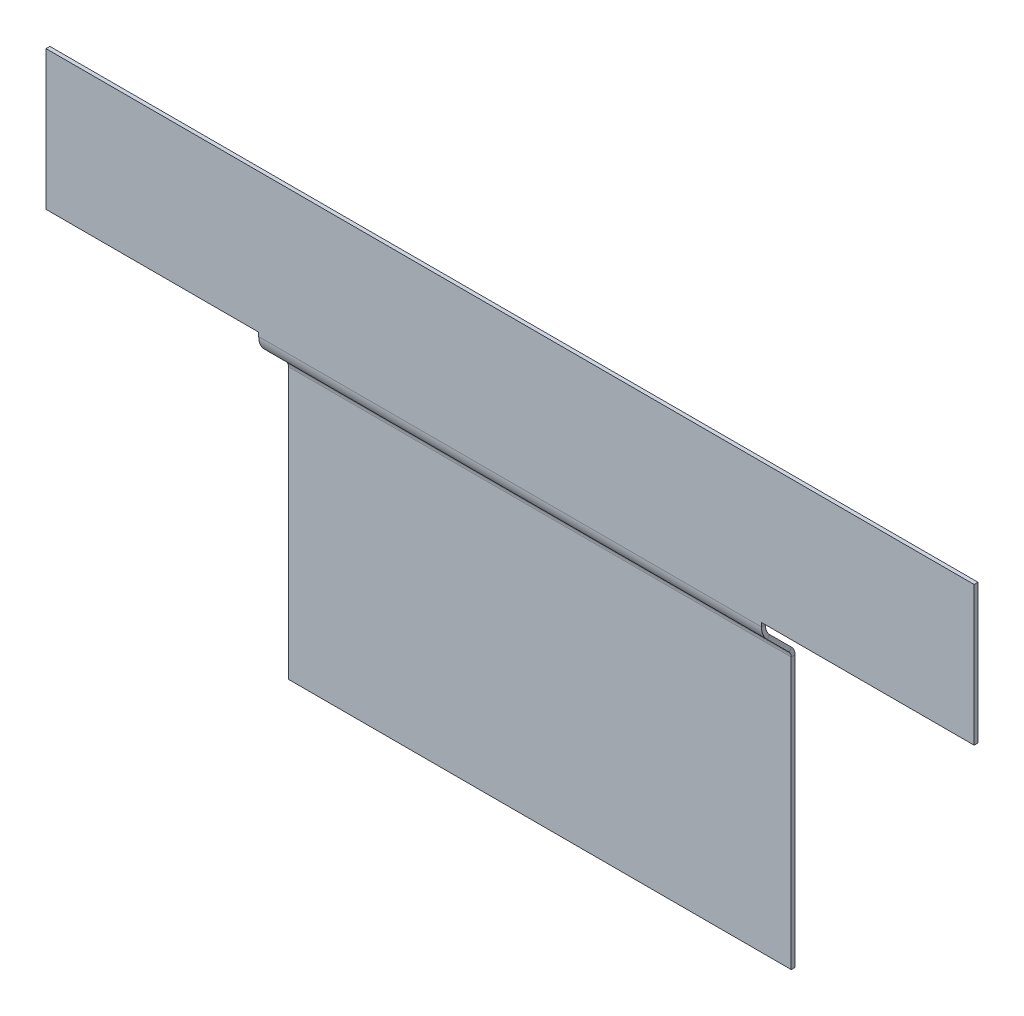
ISO-10303-21;
HEADER;
FILE_DESCRIPTION(('STEP AP214'),'2;1');
FILE_NAME('part.step','',(''),(''),'','','');
FILE_SCHEMA(('AUTOMOTIVE_DESIGN { 1 0 10303 214 1 1 1 1 }'));
ENDSEC;
DATA;
#1=APPLICATION_CONTEXT('core data for automotive mechanical design processes');
#2=APPLICATION_PROTOCOL_DEFINITION('international standard','automotive_design',2000,#1);
#3=PRODUCT_CONTEXT('',#1,'mechanical');
#4=PRODUCT('Part','Part','',(#3));
#5=PRODUCT_RELATED_PRODUCT_CATEGORY('part','',(#4));
#6=PRODUCT_DEFINITION_FORMATION('','',#4);
#7=PRODUCT_DEFINITION_CONTEXT('part definition',#1,'design');
#8=PRODUCT_DEFINITION('design','',#6,#7);
#9=PRODUCT_DEFINITION_SHAPE('','',#8);
#10=(LENGTH_UNIT() NAMED_UNIT(*) SI_UNIT(.MILLI.,.METRE.));
#11=(NAMED_UNIT(*) PLANE_ANGLE_UNIT() SI_UNIT($,.RADIAN.));
#12=(NAMED_UNIT(*) SI_UNIT($,.STERADIAN.) SOLID_ANGLE_UNIT());
#13=UNCERTAINTY_MEASURE_WITH_UNIT(LENGTH_MEASURE(1.E-05),#10,'distance_accuracy_value','');
#14=(GEOMETRIC_REPRESENTATION_CONTEXT(3) GLOBAL_UNCERTAINTY_ASSIGNED_CONTEXT((#13)) GLOBAL_UNIT_ASSIGNED_CONTEXT((#10,
#11,#12)) REPRESENTATION_CONTEXT('',''));
#15=CARTESIAN_POINT('',(0.,0.,0.));
#16=DIRECTION('',(0.,0.,1.));
#17=DIRECTION('',(1.,0.,0.));
#18=AXIS2_PLACEMENT_3D('',#15,#16,#17);
#19=CARTESIAN_POINT('',(-6.,-8.2,0.));
#20=DIRECTION('',(-1.,0.,0.));
#21=DIRECTION('',(0.,0.,1.));
#22=AXIS2_PLACEMENT_3D('',#19,#20,#21);
#23=PLANE('',#22);
#24=DIRECTION('',(0.,0.,1.));
#25=VECTOR('',#24,1.);
#26=CARTESIAN_POINT('',(-6.,-8.2,0.));
#27=LINE('',#26,#25);
#28=CARTESIAN_POINT('',(-6.,-8.2,0.));
#29=VERTEX_POINT('',#28);
#30=CARTESIAN_POINT('',(-6.,-8.2,0.05));
#31=VERTEX_POINT('',#30);
#32=EDGE_CURVE('E11',#29,#31,#27,.T.);
#33=ORIENTED_EDGE('',*,*,#32,.T.);
#34=DIRECTION('',(0.,1.,0.));
#35=VECTOR('',#34,1.);
#36=CARTESIAN_POINT('',(-6.,-8.2,0.05));
#37=LINE('',#36,#35);
#38=CARTESIAN_POINT('',(-6.,-6.4,0.05));
#39=VERTEX_POINT('',#38);
#40=EDGE_CURVE('E172',#31,#39,#37,.T.);
#41=ORIENTED_EDGE('',*,*,#40,.T.);
#42=DIRECTION('',(0.,0.,1.));
#43=VECTOR('',#42,1.);
#44=CARTESIAN_POINT('',(-6.,-6.4,0.));
#45=LINE('',#44,#43);
#46=CARTESIAN_POINT('',(-6.,-6.4,0.));
#47=VERTEX_POINT('',#46);
#48=EDGE_CURVE('E155',#47,#39,#45,.T.);
#49=ORIENTED_EDGE('',*,*,#48,.F.);
#50=DIRECTION('',(0.,1.,0.));
#51=VECTOR('',#50,1.);
#52=CARTESIAN_POINT('',(-6.,-8.2,0.));
#53=LINE('',#52,#51);
#54=EDGE_CURVE('E180',#29,#47,#53,.T.);
#55=ORIENTED_EDGE('',*,*,#54,.F.);
#56=EDGE_LOOP('',(#33,#41,#49,#55));
#57=FACE_BOUND('',#56,.T.);
#58=ADVANCED_FACE('F17',(#57),#23,.T.);
#59=CARTESIAN_POINT('',(-3.25,-8.2,0.));
#60=DIRECTION('',(0.,-1.,0.));
#61=DIRECTION('',(0.,0.,-1.));
#62=AXIS2_PLACEMENT_3D('',#59,#60,#61);
#63=PLANE('',#62);
#64=DIRECTION('',(0.,0.,1.));
#65=VECTOR('',#64,1.);
#66=CARTESIAN_POINT('',(-3.25,-8.2,0.));
#67=LINE('',#66,#65);
#68=CARTESIAN_POINT('',(-3.25,-8.2,0.));
#69=VERTEX_POINT('',#68);
#70=CARTESIAN_POINT('',(-3.25,-8.2,0.05));
#71=VERTEX_POINT('',#70);
#72=EDGE_CURVE('E167',#69,#71,#67,.T.);
#73=ORIENTED_EDGE('',*,*,#72,.T.);
#74=DIRECTION('',(-1.,0.,0.));
#75=VECTOR('',#74,1.);
#76=CARTESIAN_POINT('',(-3.25,-8.2,0.05));
#77=LINE('',#76,#75);
#78=EDGE_CURVE('E179',#71,#31,#77,.T.);
#79=ORIENTED_EDGE('',*,*,#78,.T.);
#80=ORIENTED_EDGE('',*,*,#32,.F.);
#81=DIRECTION('',(-1.,0.,0.));
#82=VECTOR('',#81,1.);
#83=CARTESIAN_POINT('',(-3.25,-8.2,0.));
#84=LINE('',#83,#82);
#85=EDGE_CURVE('E189',#69,#29,#84,.T.);
#86=ORIENTED_EDGE('',*,*,#85,.F.);
#87=EDGE_LOOP('',(#73,#79,#80,#86));
#88=FACE_BOUND('',#87,.T.);
#89=ADVANCED_FACE('F347',(#88),#63,.T.);
#90=CARTESIAN_POINT('',(6.,-6.4,0.));
#91=DIRECTION('',(1.,0.,0.));
#92=DIRECTION('',(0.,1.,0.));
#93=AXIS2_PLACEMENT_3D('',#90,#91,#92);
#94=PLANE('',#93);
#95=DIRECTION('',(0.,0.,1.));
#96=VECTOR('',#95,1.);
#97=CARTESIAN_POINT('',(6.,-6.4,0.));
#98=LINE('',#97,#96);
#99=CARTESIAN_POINT('',(6.,-6.4,0.));
#100=VERTEX_POINT('',#99);
#101=CARTESIAN_POINT('',(6.,-6.4,0.05));
#102=VERTEX_POINT('',#101);
#103=EDGE_CURVE('E20',#100,#102,#98,.T.);
#104=ORIENTED_EDGE('',*,*,#103,.T.);
#105=DIRECTION('',(0.,-1.,0.));
#106=VECTOR('',#105,1.);
#107=CARTESIAN_POINT('',(6.,-6.4,0.05));
#108=LINE('',#107,#106);
#109=CARTESIAN_POINT('',(6.,-8.2,0.05));
#110=VERTEX_POINT('',#109);
#111=EDGE_CURVE('E174',#102,#110,#108,.T.);
#112=ORIENTED_EDGE('',*,*,#111,.T.);
#113=DIRECTION('',(0.,0.,1.));
#114=VECTOR('',#113,1.);
#115=CARTESIAN_POINT('',(6.,-8.2,0.));
#116=LINE('',#115,#114);
#117=CARTESIAN_POINT('',(6.,-8.2,0.));
#118=VERTEX_POINT('',#117);
#119=EDGE_CURVE('E50',#118,#110,#116,.T.);
#120=ORIENTED_EDGE('',*,*,#119,.F.);
#121=DIRECTION('',(0.,-1.,0.));
#122=VECTOR('',#121,1.);
#123=CARTESIAN_POINT('',(6.,-6.4,0.));
#124=LINE('',#123,#122);
#125=EDGE_CURVE('E329',#100,#118,#124,.T.);
#126=ORIENTED_EDGE('',*,*,#125,.F.);
#127=EDGE_LOOP('',(#104,#112,#120,#126));
#128=FACE_BOUND('',#127,.T.);
#129=ADVANCED_FACE('F642',(#128),#94,.T.);
#130=CARTESIAN_POINT('',(-6.,-6.4,0.));
#131=DIRECTION('',(0.,1.,0.));
#132=DIRECTION('',(1.,0.,0.));
#133=AXIS2_PLACEMENT_3D('',#130,#131,#132);
#134=PLANE('',#133);
#135=ORIENTED_EDGE('',*,*,#48,.T.);
#136=DIRECTION('',(1.,0.,0.));
#137=VECTOR('',#136,1.);
#138=CARTESIAN_POINT('',(-6.,-6.4,0.05));
#139=LINE('',#138,#137);
#140=EDGE_CURVE('E158',#39,#102,#139,.T.);
#141=ORIENTED_EDGE('',*,*,#140,.T.);
#142=ORIENTED_EDGE('',*,*,#103,.F.);
#143=DIRECTION('',(1.,0.,0.));
#144=VECTOR('',#143,1.);
#145=CARTESIAN_POINT('',(-6.,-6.4,0.));
#146=LINE('',#145,#144);
#147=EDGE_CURVE('E161',#47,#100,#146,.T.);
#148=ORIENTED_EDGE('',*,*,#147,.F.);
#149=EDGE_LOOP('',(#135,#141,#142,#148));
#150=FACE_BOUND('',#149,.T.);
#151=ADVANCED_FACE('F157',(#150),#134,.T.);
#152=CARTESIAN_POINT('',(-3.25,-8.25,0.));
#153=DIRECTION('',(-1.,0.,0.));
#154=DIRECTION('',(0.,0.,1.));
#155=AXIS2_PLACEMENT_3D('',#152,#153,#154);
#156=PLANE('',#155);
#157=DIRECTION('',(0.,0.,1.));
#158=VECTOR('',#157,1.);
#159=CARTESIAN_POINT('',(-3.25,-8.25,0.));
#160=LINE('',#159,#158);
#161=CARTESIAN_POINT('',(-3.25,-8.25,0.));
#162=VERTEX_POINT('',#161);
#163=CARTESIAN_POINT('',(-3.25,-8.25,0.05));
#164=VERTEX_POINT('',#163);
#165=EDGE_CURVE('E323',#162,#164,#160,.T.);
#166=ORIENTED_EDGE('',*,*,#165,.T.);
#167=DIRECTION('',(0.,1.,0.));
#168=VECTOR('',#167,1.);
#169=CARTESIAN_POINT('',(-3.25,-8.25,0.05));
#170=LINE('',#169,#168);
#171=EDGE_CURVE('E187',#164,#71,#170,.T.);
#172=ORIENTED_EDGE('',*,*,#171,.T.);
#173=ORIENTED_EDGE('',*,*,#72,.F.);
#174=DIRECTION('',(0.,1.,0.));
#175=VECTOR('',#174,1.);
#176=CARTESIAN_POINT('',(-3.25,-8.25,0.));
#177=LINE('',#176,#175);
#178=EDGE_CURVE('E335',#162,#69,#177,.T.);
#179=ORIENTED_EDGE('',*,*,#178,.F.);
#180=EDGE_LOOP('',(#166,#172,#173,#179));
#181=FACE_BOUND('',#180,.T.);
#182=ADVANCED_FACE('F353',(#181),#156,.T.);
#183=CARTESIAN_POINT('',(6.,-8.2,0.));
#184=DIRECTION('',(0.,-1.,0.));
#185=DIRECTION('',(0.,0.,-1.));
#186=AXIS2_PLACEMENT_3D('',#183,#184,#185);
#187=PLANE('',#186);
#188=ORIENTED_EDGE('',*,*,#119,.T.);
#189=DIRECTION('',(-1.,0.,0.));
#190=VECTOR('',#189,1.);
#191=CARTESIAN_POINT('',(6.,-8.2,0.05));
#192=LINE('',#191,#190);
#193=CARTESIAN_POINT('',(3.25,-8.2,0.05));
#194=VERTEX_POINT('',#193);
#195=EDGE_CURVE('E194',#110,#194,#192,.T.);
#196=ORIENTED_EDGE('',*,*,#195,.T.);
#197=DIRECTION('',(0.,0.,1.));
#198=VECTOR('',#197,1.);
#199=CARTESIAN_POINT('',(3.25,-8.2,0.));
#200=LINE('',#199,#198);
#201=CARTESIAN_POINT('',(3.25,-8.2,0.));
#202=VERTEX_POINT('',#201);
#203=EDGE_CURVE('E284',#202,#194,#200,.T.);
#204=ORIENTED_EDGE('',*,*,#203,.F.);
#205=DIRECTION('',(-1.,0.,0.));
#206=VECTOR('',#205,1.);
#207=CARTESIAN_POINT('',(6.,-8.2,0.));
#208=LINE('',#207,#206);
#209=EDGE_CURVE('E333',#118,#202,#208,.T.);
#210=ORIENTED_EDGE('',*,*,#209,.F.);
#211=EDGE_LOOP('',(#188,#196,#204,#210));
#212=FACE_BOUND('',#211,.T.);
#213=ADVANCED_FACE('F685',(#212),#187,.T.);
#214=CARTESIAN_POINT('',(0.,-7.315072202166,0.05));
#215=DIRECTION('',(0.,0.,1.));
#216=DIRECTION('',(1.,0.,0.));
#217=AXIS2_PLACEMENT_3D('',#214,#215,#216);
#218=PLANE('',#217);
#219=ORIENTED_EDGE('',*,*,#40,.F.);
#220=ORIENTED_EDGE('',*,*,#78,.F.);
#221=ORIENTED_EDGE('',*,*,#171,.F.);
#222=DIRECTION('',(-1.,0.,0.));
#223=VECTOR('',#222,1.);
#224=CARTESIAN_POINT('',(3.25,-8.25,0.05));
#225=LINE('',#224,#223);
#226=CARTESIAN_POINT('',(3.25,-8.25,0.05));
#227=VERTEX_POINT('',#226);
#228=EDGE_CURVE('E219',#227,#164,#225,.T.);
#229=ORIENTED_EDGE('',*,*,#228,.F.);
#230=DIRECTION('',(0.,-1.,0.));
#231=VECTOR('',#230,1.);
#232=CARTESIAN_POINT('',(3.25,-8.2,0.05));
#233=LINE('',#232,#231);
#234=EDGE_CURVE('E306',#194,#227,#233,.T.);
#235=ORIENTED_EDGE('',*,*,#234,.F.);
#236=ORIENTED_EDGE('',*,*,#195,.F.);
#237=ORIENTED_EDGE('',*,*,#111,.F.);
#238=ORIENTED_EDGE('',*,*,#140,.F.);
#239=EDGE_LOOP('',(#219,#220,#221,#229,#235,#236,#237,#238));
#240=FACE_BOUND('',#239,.T.);
#241=ADVANCED_FACE('F170',(#240),#218,.T.);
#242=CARTESIAN_POINT('',(0.,-7.315072202166,0.));
#243=DIRECTION('',(0.,0.,1.));
#244=DIRECTION('',(1.,0.,0.));
#245=AXIS2_PLACEMENT_3D('',#242,#243,#244);
#246=PLANE('',#245);
#247=ORIENTED_EDGE('',*,*,#147,.T.);
#248=ORIENTED_EDGE('',*,*,#125,.T.);
#249=ORIENTED_EDGE('',*,*,#209,.T.);
#250=DIRECTION('',(0.,-1.,0.));
#251=VECTOR('',#250,1.);
#252=CARTESIAN_POINT('',(3.25,-8.2,0.));
#253=LINE('',#252,#251);
#254=CARTESIAN_POINT('',(3.25,-8.25,0.));
#255=VERTEX_POINT('',#254);
#256=EDGE_CURVE('E318',#202,#255,#253,.T.);
#257=ORIENTED_EDGE('',*,*,#256,.T.);
#258=DIRECTION('',(-1.,0.,0.));
#259=VECTOR('',#258,1.);
#260=CARTESIAN_POINT('',(3.25,-8.25,0.));
#261=LINE('',#260,#259);
#262=EDGE_CURVE('E220',#255,#162,#261,.T.);
#263=ORIENTED_EDGE('',*,*,#262,.T.);
#264=ORIENTED_EDGE('',*,*,#178,.T.);
#265=ORIENTED_EDGE('',*,*,#85,.T.);
#266=ORIENTED_EDGE('',*,*,#54,.T.);
#267=EDGE_LOOP('',(#247,#248,#249,#257,#263,#264,#265,#266));
#268=FACE_BOUND('',#267,.T.);
#269=ADVANCED_FACE('F345',(#268),#246,.F.);
#270=CARTESIAN_POINT('',(-3.25,-8.25,-0.2));
#271=DIRECTION('',(1.,0.,0.));
#272=DIRECTION('',(0.,1.,0.));
#273=AXIS2_PLACEMENT_3D('',#270,#271,#272);
#274=PLANE('',#273);
#275=ORIENTED_EDGE('',*,*,#165,.F.);
#276=CARTESIAN_POINT('',(-3.25,-8.25,-0.2));
#277=DIRECTION('',(1.,0.,0.));
#278=DIRECTION('',(0.,0.,1.));
#279=AXIS2_PLACEMENT_3D('',#276,#277,#278);
#280=CIRCLE('',#279,0.2);
#281=CARTESIAN_POINT('',(-3.25,-8.391421356237,-0.05857864376269));
#282=VERTEX_POINT('',#281);
#283=EDGE_CURVE('E216',#162,#282,#280,.T.);
#284=ORIENTED_EDGE('',*,*,#283,.T.);
#285=DIRECTION('',(0.,0.707106781186548,-0.707106781186548));
#286=VECTOR('',#285,1.);
#287=CARTESIAN_POINT('',(-3.25,-8.426776695297,-0.02322330470336));
#288=LINE('',#287,#286);
#289=CARTESIAN_POINT('',(-3.25,-8.426776695297,-0.02322330470336));
#290=VERTEX_POINT('',#289);
#291=EDGE_CURVE('E245',#290,#282,#288,.T.);
#292=ORIENTED_EDGE('',*,*,#291,.F.);
#293=CARTESIAN_POINT('',(-3.25,-8.25,-0.2));
#294=DIRECTION('',(1.,0.,0.));
#295=DIRECTION('',(0.,0.,1.));
#296=AXIS2_PLACEMENT_3D('',#293,#294,#295);
#297=CIRCLE('',#296,0.25);
#298=EDGE_CURVE('E280',#164,#290,#297,.T.);
#299=ORIENTED_EDGE('',*,*,#298,.F.);
#300=EDGE_LOOP('',(#275,#284,#292,#299));
#301=FACE_BOUND('',#300,.T.);
#302=ADVANCED_FACE('F357',(#301),#274,.F.);
#303=CARTESIAN_POINT('',(3.25,-8.2,0.));
#304=DIRECTION('',(1.,0.,0.));
#305=DIRECTION('',(0.,1.,0.));
#306=AXIS2_PLACEMENT_3D('',#303,#304,#305);
#307=PLANE('',#306);
#308=ORIENTED_EDGE('',*,*,#203,.T.);
#309=ORIENTED_EDGE('',*,*,#234,.T.);
#310=DIRECTION('',(0.,0.,1.));
#311=VECTOR('',#310,1.);
#312=CARTESIAN_POINT('',(3.25,-8.25,0.));
#313=LINE('',#312,#311);
#314=EDGE_CURVE('E302',#255,#227,#313,.T.);
#315=ORIENTED_EDGE('',*,*,#314,.F.);
#316=ORIENTED_EDGE('',*,*,#256,.F.);
#317=EDGE_LOOP('',(#308,#309,#315,#316));
#318=FACE_BOUND('',#317,.T.);
#319=ADVANCED_FACE('F746',(#318),#307,.T.);
#320=CARTESIAN_POINT('',(3.25,-8.25,-0.2));
#321=DIRECTION('',(-1.,0.,0.));
#322=DIRECTION('',(0.,0.,1.));
#323=AXIS2_PLACEMENT_3D('',#320,#321,#322);
#324=CYLINDRICAL_SURFACE('',#323,0.25);
#325=ORIENTED_EDGE('',*,*,#228,.T.);
#326=ORIENTED_EDGE('',*,*,#298,.T.);
#327=DIRECTION('',(-1.,0.,0.));
#328=VECTOR('',#327,1.);
#329=CARTESIAN_POINT('',(3.25,-8.426776695297,-0.02322330470336));
#330=LINE('',#329,#328);
#331=CARTESIAN_POINT('',(3.25,-8.426776695297,-0.02322330470336));
#332=VERTEX_POINT('',#331);
#333=EDGE_CURVE('E298',#332,#290,#330,.T.);
#334=ORIENTED_EDGE('',*,*,#333,.F.);
#335=CARTESIAN_POINT('',(3.25,-8.25,-0.2));
#336=DIRECTION('',(1.,0.,0.));
#337=DIRECTION('',(0.,0.,1.));
#338=AXIS2_PLACEMENT_3D('',#335,#336,#337);
#339=CIRCLE('',#338,0.25);
#340=EDGE_CURVE('E299',#227,#332,#339,.T.);
#341=ORIENTED_EDGE('',*,*,#340,.F.);
#342=EDGE_LOOP('',(#325,#326,#334,#341));
#343=FACE_BOUND('',#342,.T.);
#344=ADVANCED_FACE('F361',(#343),#324,.T.);
#345=CARTESIAN_POINT('',(-3.25,-8.25,-0.2));
#346=DIRECTION('',(1.,0.,0.));
#347=DIRECTION('',(0.,0.,1.));
#348=AXIS2_PLACEMENT_3D('',#345,#346,#347);
#349=CYLINDRICAL_SURFACE('',#348,0.2);
#350=ORIENTED_EDGE('',*,*,#262,.F.);
#351=CARTESIAN_POINT('',(3.25,-8.25,-0.2));
#352=DIRECTION('',(1.,0.,0.));
#353=DIRECTION('',(0.,0.,1.));
#354=AXIS2_PLACEMENT_3D('',#351,#352,#353);
#355=CIRCLE('',#354,0.2);
#356=CARTESIAN_POINT('',(3.25,-8.391421356237,-0.05857864376269));
#357=VERTEX_POINT('',#356);
#358=EDGE_CURVE('E249',#255,#357,#355,.T.);
#359=ORIENTED_EDGE('',*,*,#358,.T.);
#360=DIRECTION('',(1.,0.,0.));
#361=VECTOR('',#360,1.);
#362=CARTESIAN_POINT('',(-3.25,-8.391421356237,-0.05857864376269));
#363=LINE('',#362,#361);
#364=EDGE_CURVE('E278',#282,#357,#363,.T.);
#365=ORIENTED_EDGE('',*,*,#364,.F.);
#366=ORIENTED_EDGE('',*,*,#283,.F.);
#367=EDGE_LOOP('',(#350,#359,#365,#366));
#368=FACE_BOUND('',#367,.T.);
#369=ADVANCED_FACE('F729',(#368),#349,.F.);
#370=CARTESIAN_POINT('',(-3.25,-8.674264068712,-0.341421356237));
#371=DIRECTION('',(-1.,0.,0.));
#372=DIRECTION('',(0.,0.,1.));
#373=AXIS2_PLACEMENT_3D('',#370,#371,#372);
#374=PLANE('',#373);
#375=DIRECTION('',(0.,-0.707106781186548,0.707106781186548));
#376=VECTOR('',#375,1.);
#377=CARTESIAN_POINT('',(-3.25,-8.674264068712,-0.341421356237));
#378=LINE('',#377,#376);
#379=CARTESIAN_POINT('',(-3.25,-8.674264068712,-0.341421356237));
#380=VERTEX_POINT('',#379);
#381=CARTESIAN_POINT('',(-3.25,-8.709619407771,-0.306066017178));
#382=VERTEX_POINT('',#381);
#383=EDGE_CURVE('E275',#380,#382,#378,.T.);
#384=ORIENTED_EDGE('',*,*,#383,.T.);
#385=DIRECTION('',(0.,0.707106781186548,0.707106781186548));
#386=VECTOR('',#385,1.);
#387=CARTESIAN_POINT('',(-3.25,-8.709619407771,-0.306066017178));
#388=LINE('',#387,#386);
#389=EDGE_CURVE('E294',#382,#290,#388,.T.);
#390=ORIENTED_EDGE('',*,*,#389,.T.);
#391=ORIENTED_EDGE('',*,*,#291,.T.);
#392=DIRECTION('',(0.,0.707106781186548,0.707106781186548));
#393=VECTOR('',#392,1.);
#394=CARTESIAN_POINT('',(-3.25,-8.674264068712,-0.341421356237));
#395=LINE('',#394,#393);
#396=EDGE_CURVE('E288',#380,#282,#395,.T.);
#397=ORIENTED_EDGE('',*,*,#396,.F.);
#398=EDGE_LOOP('',(#384,#390,#391,#397));
#399=FACE_BOUND('',#398,.T.);
#400=ADVANCED_FACE('F618',(#399),#374,.T.);
#401=CARTESIAN_POINT('',(3.25,-8.25,-0.2));
#402=DIRECTION('',(1.,0.,0.));
#403=DIRECTION('',(0.,1.,0.));
#404=AXIS2_PLACEMENT_3D('',#401,#402,#403);
#405=PLANE('',#404);
#406=ORIENTED_EDGE('',*,*,#314,.T.);
#407=ORIENTED_EDGE('',*,*,#340,.T.);
#408=DIRECTION('',(0.,-0.707106781186548,0.707106781186548));
#409=VECTOR('',#408,1.);
#410=CARTESIAN_POINT('',(3.25,-8.391421356237,-0.05857864376269));
#411=LINE('',#410,#409);
#412=EDGE_CURVE('E262',#357,#332,#411,.T.);
#413=ORIENTED_EDGE('',*,*,#412,.F.);
#414=ORIENTED_EDGE('',*,*,#358,.F.);
#415=EDGE_LOOP('',(#406,#407,#413,#414));
#416=FACE_BOUND('',#415,.T.);
#417=ADVANCED_FACE('F368',(#416),#405,.T.);
#418=CARTESIAN_POINT('',(0.,-8.568198051534,-0.164644660941));
#419=DIRECTION('',(0.,0.707106781186548,-0.707106781186548));
#420=DIRECTION('',(-1.,0.,0.));
#421=AXIS2_PLACEMENT_3D('',#418,#419,#420);
#422=PLANE('',#421);
#423=ORIENTED_EDGE('',*,*,#389,.F.);
#424=DIRECTION('',(-1.,0.,0.));
#425=VECTOR('',#424,1.);
#426=CARTESIAN_POINT('',(3.25,-8.709619407771,-0.306066017178));
#427=LINE('',#426,#425);
#428=CARTESIAN_POINT('',(3.25,-8.709619407771,-0.306066017178));
#429=VERTEX_POINT('',#428);
#430=EDGE_CURVE('E254',#429,#382,#427,.T.);
#431=ORIENTED_EDGE('',*,*,#430,.F.);
#432=DIRECTION('',(0.,-0.707106781186548,-0.707106781186548));
#433=VECTOR('',#432,1.);
#434=CARTESIAN_POINT('',(3.25,-8.426776695297,-0.02322330470336));
#435=LINE('',#434,#433);
#436=EDGE_CURVE('E266',#332,#429,#435,.T.);
#437=ORIENTED_EDGE('',*,*,#436,.F.);
#438=ORIENTED_EDGE('',*,*,#333,.T.);
#439=EDGE_LOOP('',(#423,#431,#437,#438));
#440=FACE_BOUND('',#439,.T.);
#441=ADVANCED_FACE('F440',(#440),#422,.F.);
#442=CARTESIAN_POINT('',(0.,-8.532842712475,-0.2));
#443=DIRECTION('',(0.,0.707106781186548,-0.707106781186548));
#444=DIRECTION('',(-1.,0.,0.));
#445=AXIS2_PLACEMENT_3D('',#442,#443,#444);
#446=PLANE('',#445);
#447=ORIENTED_EDGE('',*,*,#364,.T.);
#448=DIRECTION('',(0.,-0.707106781186548,-0.707106781186548));
#449=VECTOR('',#448,1.);
#450=CARTESIAN_POINT('',(3.25,-8.391421356237,-0.05857864376269));
#451=LINE('',#450,#449);
#452=CARTESIAN_POINT('',(3.25,-8.674264068712,-0.341421356237));
#453=VERTEX_POINT('',#452);
#454=EDGE_CURVE('E269',#357,#453,#451,.T.);
#455=ORIENTED_EDGE('',*,*,#454,.T.);
#456=DIRECTION('',(-1.,0.,0.));
#457=VECTOR('',#456,1.);
#458=CARTESIAN_POINT('',(3.25,-8.674264068712,-0.341421356237));
#459=LINE('',#458,#457);
#460=EDGE_CURVE('E208',#453,#380,#459,.T.);
#461=ORIENTED_EDGE('',*,*,#460,.T.);
#462=ORIENTED_EDGE('',*,*,#396,.T.);
#463=EDGE_LOOP('',(#447,#455,#461,#462));
#464=FACE_BOUND('',#463,.T.);
#465=ADVANCED_FACE('F429',(#464),#446,.T.);
#466=CARTESIAN_POINT('',(-3.25,-8.78033008589,-0.235355339059));
#467=DIRECTION('',(-1.,0.,0.));
#468=DIRECTION('',(0.,0.,1.));
#469=AXIS2_PLACEMENT_3D('',#466,#467,#468);
#470=PLANE('',#469);
#471=ORIENTED_EDGE('',*,*,#383,.F.);
#472=CARTESIAN_POINT('',(-3.25,-8.78033008589,-0.235355339059));
#473=DIRECTION('',(-1.,0.,0.));
#474=DIRECTION('',(0.,0.707106781186548,-0.707106781186548));
#475=AXIS2_PLACEMENT_3D('',#472,#473,#474);
#476=CIRCLE('',#475,0.15);
#477=CARTESIAN_POINT('',(-3.25,-8.78033008589,-0.385355339059));
#478=VERTEX_POINT('',#477);
#479=EDGE_CURVE('E250',#380,#478,#476,.T.);
#480=ORIENTED_EDGE('',*,*,#479,.T.);
#481=DIRECTION('',(0.,0.,-1.));
#482=VECTOR('',#481,1.);
#483=CARTESIAN_POINT('',(-3.25,-8.78033008589,-0.335355339059));
#484=LINE('',#483,#482);
#485=CARTESIAN_POINT('',(-3.25,-8.78033008589,-0.335355339059));
#486=VERTEX_POINT('',#485);
#487=EDGE_CURVE('E272',#486,#478,#484,.T.);
#488=ORIENTED_EDGE('',*,*,#487,.F.);
#489=CARTESIAN_POINT('',(-3.25,-8.78033008589,-0.235355339059));
#490=DIRECTION('',(-1.,0.,0.));
#491=DIRECTION('',(0.,0.707106781186548,-0.707106781186548));
#492=AXIS2_PLACEMENT_3D('',#489,#490,#491);
#493=CIRCLE('',#492,0.1);
#494=EDGE_CURVE('E258',#382,#486,#493,.T.);
#495=ORIENTED_EDGE('',*,*,#494,.F.);
#496=EDGE_LOOP('',(#471,#480,#488,#495));
#497=FACE_BOUND('',#496,.T.);
#498=ADVANCED_FACE('F445',(#497),#470,.T.);
#499=CARTESIAN_POINT('',(-3.25,-12.28033008589,-0.385355339059));
#500=DIRECTION('',(-1.,0.,0.));
#501=DIRECTION('',(0.,0.,1.));
#502=AXIS2_PLACEMENT_3D('',#499,#500,#501);
#503=PLANE('',#502);
#504=DIRECTION('',(0.,0.,1.));
#505=VECTOR('',#504,1.);
#506=CARTESIAN_POINT('',(-3.25,-12.28033008589,-0.385355339059));
#507=LINE('',#506,#505);
#508=CARTESIAN_POINT('',(-3.25,-12.28033008589,-0.385355339059));
#509=VERTEX_POINT('',#508);
#510=CARTESIAN_POINT('',(-3.25,-12.28033008589,-0.335355339059));
#511=VERTEX_POINT('',#510);
#512=EDGE_CURVE('E224',#509,#511,#507,.T.);
#513=ORIENTED_EDGE('',*,*,#512,.T.);
#514=DIRECTION('',(0.,1.,0.));
#515=VECTOR('',#514,1.);
#516=CARTESIAN_POINT('',(-3.25,-12.28033008589,-0.335355339059));
#517=LINE('',#516,#515);
#518=EDGE_CURVE('E233',#511,#486,#517,.T.);
#519=ORIENTED_EDGE('',*,*,#518,.T.);
#520=ORIENTED_EDGE('',*,*,#487,.T.);
#521=DIRECTION('',(0.,1.,0.));
#522=VECTOR('',#521,1.);
#523=CARTESIAN_POINT('',(-3.25,-12.28033008589,-0.385355339059));
#524=LINE('',#523,#522);
#525=EDGE_CURVE('E229',#509,#478,#524,.T.);
#526=ORIENTED_EDGE('',*,*,#525,.F.);
#527=EDGE_LOOP('',(#513,#519,#520,#526));
#528=FACE_BOUND('',#527,.T.);
#529=ADVANCED_FACE('F447',(#528),#503,.T.);
#530=CARTESIAN_POINT('',(3.25,-8.391421356237,-0.05857864376269));
#531=DIRECTION('',(1.,0.,0.));
#532=DIRECTION('',(0.,0.,1.));
#533=AXIS2_PLACEMENT_3D('',#530,#531,#532);
#534=PLANE('',#533);
#535=ORIENTED_EDGE('',*,*,#412,.T.);
#536=ORIENTED_EDGE('',*,*,#436,.T.);
#537=DIRECTION('',(0.,-0.707106781186548,0.707106781186548));
#538=VECTOR('',#537,1.);
#539=CARTESIAN_POINT('',(3.25,-8.674264068712,-0.341421356237));
#540=LINE('',#539,#538);
#541=EDGE_CURVE('E385',#453,#429,#540,.T.);
#542=ORIENTED_EDGE('',*,*,#541,.F.);
#543=ORIENTED_EDGE('',*,*,#454,.F.);
#544=EDGE_LOOP('',(#535,#536,#542,#543));
#545=FACE_BOUND('',#544,.T.);
#546=ADVANCED_FACE('F437',(#545),#534,.T.);
#547=CARTESIAN_POINT('',(3.25,-8.78033008589,-0.235355339059));
#548=DIRECTION('',(-1.,0.,0.));
#549=DIRECTION('',(0.,0.707106781186548,-0.707106781186548));
#550=AXIS2_PLACEMENT_3D('',#547,#548,#549);
#551=CYLINDRICAL_SURFACE('',#550,0.1);
#552=ORIENTED_EDGE('',*,*,#430,.T.);
#553=ORIENTED_EDGE('',*,*,#494,.T.);
#554=DIRECTION('',(-1.,0.,0.));
#555=VECTOR('',#554,1.);
#556=CARTESIAN_POINT('',(3.25,-8.78033008589,-0.335355339059));
#557=LINE('',#556,#555);
#558=CARTESIAN_POINT('',(3.25,-8.78033008589,-0.335355339059));
#559=VERTEX_POINT('',#558);
#560=EDGE_CURVE('E244',#559,#486,#557,.T.);
#561=ORIENTED_EDGE('',*,*,#560,.F.);
#562=CARTESIAN_POINT('',(3.25,-8.78033008589,-0.235355339059));
#563=DIRECTION('',(-1.,0.,0.));
#564=DIRECTION('',(0.,0.707106781186548,-0.707106781186548));
#565=AXIS2_PLACEMENT_3D('',#562,#563,#564);
#566=CIRCLE('',#565,0.1);
#567=EDGE_CURVE('E215',#429,#559,#566,.T.);
#568=ORIENTED_EDGE('',*,*,#567,.F.);
#569=EDGE_LOOP('',(#552,#553,#561,#568));
#570=FACE_BOUND('',#569,.T.);
#571=ADVANCED_FACE('F441',(#570),#551,.F.);
#572=CARTESIAN_POINT('',(-3.25,-8.78033008589,-0.235355339059));
#573=DIRECTION('',(1.,0.,0.));
#574=DIRECTION('',(0.,0.707106781186548,-0.707106781186548));
#575=AXIS2_PLACEMENT_3D('',#572,#573,#574);
#576=CYLINDRICAL_SURFACE('',#575,0.15);
#577=ORIENTED_EDGE('',*,*,#460,.F.);
#578=CARTESIAN_POINT('',(3.25,-8.78033008589,-0.235355339059));
#579=DIRECTION('',(-1.,0.,0.));
#580=DIRECTION('',(0.,0.707106781186548,-0.707106781186548));
#581=AXIS2_PLACEMENT_3D('',#578,#579,#580);
#582=CIRCLE('',#581,0.15);
#583=CARTESIAN_POINT('',(3.25,-8.78033008589,-0.385355339059));
#584=VERTEX_POINT('',#583);
#585=EDGE_CURVE('E210',#453,#584,#582,.T.);
#586=ORIENTED_EDGE('',*,*,#585,.T.);
#587=DIRECTION('',(1.,0.,0.));
#588=VECTOR('',#587,1.);
#589=CARTESIAN_POINT('',(-3.25,-8.78033008589,-0.385355339059));
#590=LINE('',#589,#588);
#591=EDGE_CURVE('E234',#478,#584,#590,.T.);
#592=ORIENTED_EDGE('',*,*,#591,.F.);
#593=ORIENTED_EDGE('',*,*,#479,.F.);
#594=EDGE_LOOP('',(#577,#586,#592,#593));
#595=FACE_BOUND('',#594,.T.);
#596=ADVANCED_FACE('F434',(#595),#576,.T.);
#597=CARTESIAN_POINT('',(0.,-10.53033008589,-0.335355339059));
#598=DIRECTION('',(0.,0.,-1.));
#599=DIRECTION('',(-1.,0.,0.));
#600=AXIS2_PLACEMENT_3D('',#597,#598,#599);
#601=PLANE('',#600);
#602=ORIENTED_EDGE('',*,*,#518,.F.);
#603=DIRECTION('',(-1.,0.,0.));
#604=VECTOR('',#603,1.);
#605=CARTESIAN_POINT('',(3.25,-12.28033008589,-0.335355339059));
#606=LINE('',#605,#604);
#607=CARTESIAN_POINT('',(3.25,-12.28033008589,-0.335355339059));
#608=VERTEX_POINT('',#607);
#609=EDGE_CURVE('E214',#608,#511,#606,.T.);
#610=ORIENTED_EDGE('',*,*,#609,.F.);
#611=DIRECTION('',(0.,-1.,0.));
#612=VECTOR('',#611,1.);
#613=CARTESIAN_POINT('',(3.25,-8.78033008589,-0.335355339059));
#614=LINE('',#613,#612);
#615=EDGE_CURVE('E407',#559,#608,#614,.T.);
#616=ORIENTED_EDGE('',*,*,#615,.F.);
#617=ORIENTED_EDGE('',*,*,#560,.T.);
#618=EDGE_LOOP('',(#602,#610,#616,#617));
#619=FACE_BOUND('',#618,.T.);
#620=ADVANCED_FACE('F408',(#619),#601,.F.);
#621=CARTESIAN_POINT('',(0.,-10.53033008589,-0.385355339059));
#622=DIRECTION('',(0.,0.,-1.));
#623=DIRECTION('',(-1.,0.,0.));
#624=AXIS2_PLACEMENT_3D('',#621,#622,#623);
#625=PLANE('',#624);
#626=ORIENTED_EDGE('',*,*,#591,.T.);
#627=DIRECTION('',(0.,-1.,0.));
#628=VECTOR('',#627,1.);
#629=CARTESIAN_POINT('',(3.25,-8.78033008589,-0.385355339059));
#630=LINE('',#629,#628);
#631=CARTESIAN_POINT('',(3.25,-12.28033008589,-0.385355339059));
#632=VERTEX_POINT('',#631);
#633=EDGE_CURVE('E381',#584,#632,#630,.T.);
#634=ORIENTED_EDGE('',*,*,#633,.T.);
#635=DIRECTION('',(-1.,0.,0.));
#636=VECTOR('',#635,1.);
#637=CARTESIAN_POINT('',(3.25,-12.28033008589,-0.385355339059));
#638=LINE('',#637,#636);
#639=EDGE_CURVE('E228',#632,#509,#638,.T.);
#640=ORIENTED_EDGE('',*,*,#639,.T.);
#641=ORIENTED_EDGE('',*,*,#525,.T.);
#642=EDGE_LOOP('',(#626,#634,#640,#641));
#643=FACE_BOUND('',#642,.T.);
#644=ADVANCED_FACE('F651',(#643),#625,.T.);
#645=CARTESIAN_POINT('',(3.25,-12.28033008589,-0.385355339059));
#646=DIRECTION('',(0.,-1.,0.));
#647=DIRECTION('',(0.,0.,-1.));
#648=AXIS2_PLACEMENT_3D('',#645,#646,#647);
#649=PLANE('',#648);
#650=DIRECTION('',(0.,0.,1.));
#651=VECTOR('',#650,1.);
#652=CARTESIAN_POINT('',(3.25,-12.28033008589,-0.385355339059));
#653=LINE('',#652,#651);
#654=EDGE_CURVE('E378',#632,#608,#653,.T.);
#655=ORIENTED_EDGE('',*,*,#654,.T.);
#656=ORIENTED_EDGE('',*,*,#609,.T.);
#657=ORIENTED_EDGE('',*,*,#512,.F.);
#658=ORIENTED_EDGE('',*,*,#639,.F.);
#659=EDGE_LOOP('',(#655,#656,#657,#658));
#660=FACE_BOUND('',#659,.T.);
#661=ADVANCED_FACE('F450',(#660),#649,.T.);
#662=CARTESIAN_POINT('',(3.25,-8.78033008589,-0.235355339059));
#663=DIRECTION('',(-1.,0.,0.));
#664=DIRECTION('',(0.,0.,1.));
#665=AXIS2_PLACEMENT_3D('',#662,#663,#664);
#666=PLANE('',#665);
#667=ORIENTED_EDGE('',*,*,#541,.T.);
#668=ORIENTED_EDGE('',*,*,#567,.T.);
#669=DIRECTION('',(0.,0.,1.));
#670=VECTOR('',#669,1.);
#671=CARTESIAN_POINT('',(3.25,-8.78033008589,-0.385355339059));
#672=LINE('',#671,#670);
#673=EDGE_CURVE('E400',#584,#559,#672,.T.);
#674=ORIENTED_EDGE('',*,*,#673,.F.);
#675=ORIENTED_EDGE('',*,*,#585,.F.);
#676=EDGE_LOOP('',(#667,#668,#674,#675));
#677=FACE_BOUND('',#676,.T.);
#678=ADVANCED_FACE('F396',(#677),#666,.F.);
#679=CARTESIAN_POINT('',(3.25,-8.78033008589,-0.385355339059));
#680=DIRECTION('',(1.,0.,0.));
#681=DIRECTION('',(0.,0.,1.));
#682=AXIS2_PLACEMENT_3D('',#679,#680,#681);
#683=PLANE('',#682);
#684=ORIENTED_EDGE('',*,*,#673,.T.);
#685=ORIENTED_EDGE('',*,*,#615,.T.);
#686=ORIENTED_EDGE('',*,*,#654,.F.);
#687=ORIENTED_EDGE('',*,*,#633,.F.);
#688=EDGE_LOOP('',(#684,#685,#686,#687));
#689=FACE_BOUND('',#688,.T.);
#690=ADVANCED_FACE('F415',(#689),#683,.T.);
#691=CLOSED_SHELL('',(#58,#89,#129,#151,#182,#213,#241,#269,#302,#319,#344,#369,#400,#417,#441,
#465,#498,#529,#546,#571,#596,#620,#644,#661,#678,#690));
#692=MANIFOLD_SOLID_BREP('B1',#691);
#693=ADVANCED_BREP_SHAPE_REPRESENTATION('',(#18,#692),#14);
#694=SHAPE_DEFINITION_REPRESENTATION(#9,#693);
ENDSEC;
END-ISO-10303-21;
